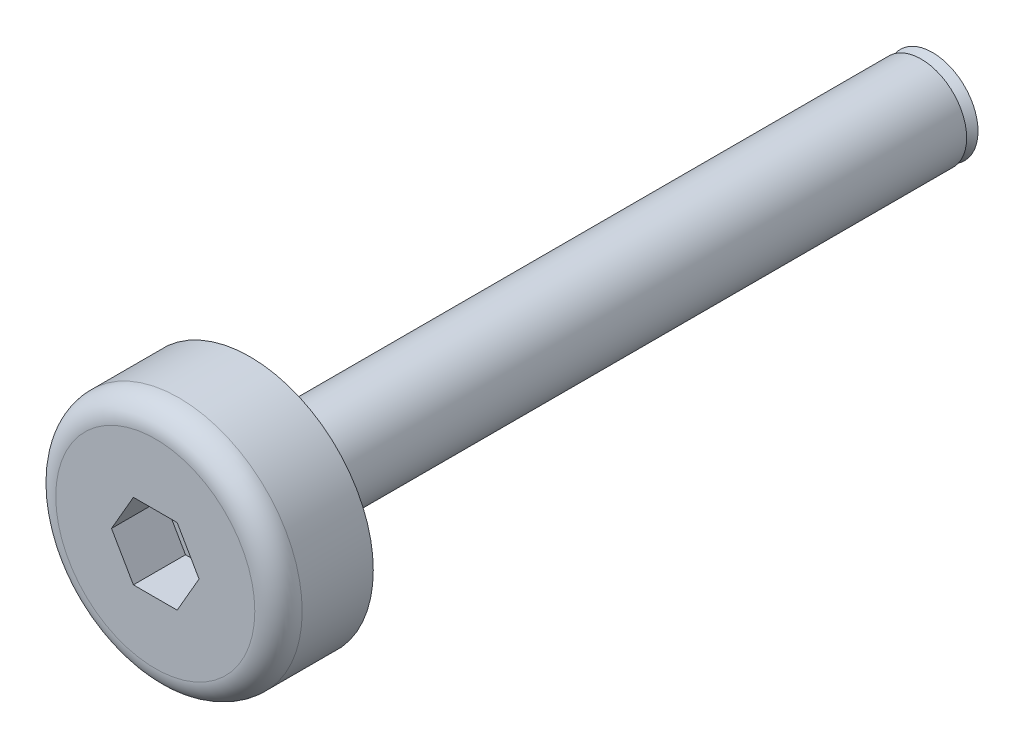
ISO-10303-21;
HEADER;
FILE_DESCRIPTION(('STEP AP214'),'2;1');
FILE_NAME('part.step','',(''),(''),'','','');
FILE_SCHEMA(('AUTOMOTIVE_DESIGN { 1 0 10303 214 1 1 1 1 }'));
ENDSEC;
DATA;
#1=APPLICATION_CONTEXT('core data for automotive mechanical design processes');
#2=APPLICATION_PROTOCOL_DEFINITION('international standard','automotive_design',2000,#1);
#3=PRODUCT_CONTEXT('',#1,'mechanical');
#4=PRODUCT('Part','Part','',(#3));
#5=PRODUCT_RELATED_PRODUCT_CATEGORY('part','',(#4));
#6=PRODUCT_DEFINITION_FORMATION('','',#4);
#7=PRODUCT_DEFINITION_CONTEXT('part definition',#1,'design');
#8=PRODUCT_DEFINITION('design','',#6,#7);
#9=PRODUCT_DEFINITION_SHAPE('','',#8);
#10=(LENGTH_UNIT() NAMED_UNIT(*) SI_UNIT(.MILLI.,.METRE.));
#11=(NAMED_UNIT(*) PLANE_ANGLE_UNIT() SI_UNIT($,.RADIAN.));
#12=(NAMED_UNIT(*) SI_UNIT($,.STERADIAN.) SOLID_ANGLE_UNIT());
#13=UNCERTAINTY_MEASURE_WITH_UNIT(LENGTH_MEASURE(1.E-05),#10,'distance_accuracy_value','');
#14=(GEOMETRIC_REPRESENTATION_CONTEXT(3) GLOBAL_UNCERTAINTY_ASSIGNED_CONTEXT((#13)) GLOBAL_UNIT_ASSIGNED_CONTEXT((#10,
#11,#12)) REPRESENTATION_CONTEXT('',''));
#15=CARTESIAN_POINT('',(0.,0.,0.));
#16=DIRECTION('',(0.,0.,1.));
#17=DIRECTION('',(1.,0.,0.));
#18=AXIS2_PLACEMENT_3D('',#15,#16,#17);
#19=CARTESIAN_POINT('',(0.,0.,2.5));
#20=DIRECTION('',(0.,0.,1.));
#21=DIRECTION('',(1.,0.,0.));
#22=AXIS2_PLACEMENT_3D('',#19,#20,#21);
#23=PLANE('',#22);
#24=CARTESIAN_POINT('',(0.,0.,2.5));
#25=DIRECTION('',(0.,0.,1.));
#26=DIRECTION('',(1.,0.,0.));
#27=AXIS2_PLACEMENT_3D('',#24,#25,#26);
#28=CIRCLE('',#27,2.625);
#29=CARTESIAN_POINT('',(2.625,0.,2.5));
#30=VERTEX_POINT('',#29);
#31=EDGE_CURVE('E142',#30,#30,#28,.T.);
#32=ORIENTED_EDGE('',*,*,#31,.T.);
#33=EDGE_LOOP('',(#32));
#34=FACE_BOUND('',#33,.T.);
#35=DIRECTION('',(0.5,-0.866025403784439,0.));
#36=VECTOR('',#35,1.);
#37=CARTESIAN_POINT('',(0.866025403784439,0.5,2.5));
#38=LINE('',#37,#36);
#39=CARTESIAN_POINT('',(0.577350269189626,1.,2.5));
#40=VERTEX_POINT('',#39);
#41=CARTESIAN_POINT('',(1.15470053837925,0.,2.5));
#42=VERTEX_POINT('',#41);
#43=EDGE_CURVE('E51',#40,#42,#38,.T.);
#44=ORIENTED_EDGE('',*,*,#43,.T.);
#45=DIRECTION('',(-0.5,-0.866025403784439,0.));
#46=VECTOR('',#45,1.);
#47=CARTESIAN_POINT('',(0.866025403784439,-0.5,2.5));
#48=LINE('',#47,#46);
#49=CARTESIAN_POINT('',(0.577350269189626,-1.,2.5));
#50=VERTEX_POINT('',#49);
#51=EDGE_CURVE('E11',#42,#50,#48,.T.);
#52=ORIENTED_EDGE('',*,*,#51,.T.);
#53=DIRECTION('',(-1.,0.,0.));
#54=VECTOR('',#53,1.);
#55=CARTESIAN_POINT('',(0.,-1.,2.5));
#56=LINE('',#55,#54);
#57=CARTESIAN_POINT('',(-0.577350269189626,-1.,2.5));
#58=VERTEX_POINT('',#57);
#59=EDGE_CURVE('E148',#50,#58,#56,.T.);
#60=ORIENTED_EDGE('',*,*,#59,.T.);
#61=DIRECTION('',(-0.5,0.866025403784439,0.));
#62=VECTOR('',#61,1.);
#63=CARTESIAN_POINT('',(-0.866025403784439,-0.5,2.5));
#64=LINE('',#63,#62);
#65=CARTESIAN_POINT('',(-1.15470053837925,0.,2.5));
#66=VERTEX_POINT('',#65);
#67=EDGE_CURVE('E151',#58,#66,#64,.T.);
#68=ORIENTED_EDGE('',*,*,#67,.T.);
#69=DIRECTION('',(0.5,0.866025403784439,0.));
#70=VECTOR('',#69,1.);
#71=CARTESIAN_POINT('',(-0.866025403784438,0.5,2.5));
#72=LINE('',#71,#70);
#73=CARTESIAN_POINT('',(-0.577350269189625,0.999999999999999,2.5));
#74=VERTEX_POINT('',#73);
#75=EDGE_CURVE('E154',#66,#74,#72,.T.);
#76=ORIENTED_EDGE('',*,*,#75,.T.);
#77=DIRECTION('',(1.,0.,0.));
#78=VECTOR('',#77,1.);
#79=CARTESIAN_POINT('',(0.,1.,2.5));
#80=LINE('',#79,#78);
#81=EDGE_CURVE('E157',#74,#40,#80,.T.);
#82=ORIENTED_EDGE('',*,*,#81,.T.);
#83=EDGE_LOOP('',(#44,#52,#60,#68,#76,#82));
#84=FACE_BOUND('',#83,.T.);
#85=ADVANCED_FACE('F43',(#34,#84),#23,.T.);
#86=CARTESIAN_POINT('',(0.,0.,2.5));
#87=DIRECTION('',(0.,0.,-1.));
#88=DIRECTION('',(-1.,0.,0.));
#89=AXIS2_PLACEMENT_3D('',#86,#87,#88);
#90=CYLINDRICAL_SURFACE('',#89,3.25);
#91=CARTESIAN_POINT('',(0.,0.,1.875));
#92=DIRECTION('',(0.,0.,1.));
#93=DIRECTION('',(1.,0.,0.));
#94=AXIS2_PLACEMENT_3D('',#91,#92,#93);
#95=CIRCLE('',#94,3.25);
#96=CARTESIAN_POINT('',(3.25,0.,1.875));
#97=VERTEX_POINT('',#96);
#98=EDGE_CURVE('E145',#97,#97,#95,.F.);
#99=ORIENTED_EDGE('',*,*,#98,.T.);
#100=EDGE_LOOP('',(#99));
#101=FACE_BOUND('',#100,.T.);
#102=CARTESIAN_POINT('',(0.,0.,0.));
#103=DIRECTION('',(0.,0.,1.));
#104=DIRECTION('',(1.,0.,0.));
#105=AXIS2_PLACEMENT_3D('',#102,#103,#104);
#106=CIRCLE('',#105,3.25);
#107=CARTESIAN_POINT('',(3.25,0.,0.));
#108=VERTEX_POINT('',#107);
#109=EDGE_CURVE('E100',#108,#108,#106,.T.);
#110=ORIENTED_EDGE('',*,*,#109,.T.);
#111=EDGE_LOOP('',(#110));
#112=FACE_BOUND('',#111,.T.);
#113=ADVANCED_FACE('F181',(#101,#112),#90,.T.);
#114=CARTESIAN_POINT('',(0.,0.,0.));
#115=DIRECTION('',(0.,0.,1.));
#116=DIRECTION('',(1.,0.,0.));
#117=AXIS2_PLACEMENT_3D('',#114,#115,#116);
#118=PLANE('',#117);
#119=CARTESIAN_POINT('',(0.,0.,0.));
#120=DIRECTION('',(0.,0.,1.));
#121=DIRECTION('',(1.,0.,0.));
#122=AXIS2_PLACEMENT_3D('',#119,#120,#121);
#123=CIRCLE('',#122,1.2);
#124=CARTESIAN_POINT('',(1.2,0.,0.));
#125=VERTEX_POINT('',#124);
#126=EDGE_CURVE('E119',#125,#125,#123,.T.);
#127=ORIENTED_EDGE('',*,*,#126,.T.);
#128=EDGE_LOOP('',(#127));
#129=FACE_BOUND('',#128,.T.);
#130=ORIENTED_EDGE('',*,*,#109,.F.);
#131=EDGE_LOOP('',(#130));
#132=FACE_BOUND('',#131,.T.);
#133=ADVANCED_FACE('F187',(#129,#132),#118,.F.);
#134=CARTESIAN_POINT('',(0.,0.,1.875));
#135=DIRECTION('',(0.,0.,1.));
#136=DIRECTION('',(1.,0.,0.));
#137=AXIS2_PLACEMENT_3D('',#134,#135,#136);
#138=TOROIDAL_SURFACE('',#137,2.625,0.625);
#139=ORIENTED_EDGE('',*,*,#98,.F.);
#140=EDGE_LOOP('',(#139));
#141=FACE_BOUND('',#140,.T.);
#142=ORIENTED_EDGE('',*,*,#31,.F.);
#143=EDGE_LOOP('',(#142));
#144=FACE_BOUND('',#143,.T.);
#145=ADVANCED_FACE('F45',(#141,#144),#138,.T.);
#146=CARTESIAN_POINT('',(0.577350269189626,-1.,2.51));
#147=DIRECTION('',(-0.866025403784439,0.5,0.));
#148=DIRECTION('',(-0.5,-0.866025403784439,0.));
#149=AXIS2_PLACEMENT_3D('',#146,#147,#148);
#150=PLANE('',#149);
#151=DIRECTION('',(0.,0.,-1.));
#152=VECTOR('',#151,1.);
#153=CARTESIAN_POINT('',(1.15470053837925,0.,2.51));
#154=LINE('',#153,#152);
#155=CARTESIAN_POINT('',(1.15470053837925,0.,1.125));
#156=VERTEX_POINT('',#155);
#157=EDGE_CURVE('E93',#42,#156,#154,.T.);
#158=ORIENTED_EDGE('',*,*,#157,.T.);
#159=DIRECTION('',(0.5,0.866025403784439,0.));
#160=VECTOR('',#159,1.);
#161=CARTESIAN_POINT('',(0.577350269189626,-1.,1.125));
#162=LINE('',#161,#160);
#163=CARTESIAN_POINT('',(0.577350269189626,-1.,1.125));
#164=VERTEX_POINT('',#163);
#165=EDGE_CURVE('E97',#164,#156,#162,.T.);
#166=ORIENTED_EDGE('',*,*,#165,.F.);
#167=DIRECTION('',(0.,0.,-1.));
#168=VECTOR('',#167,1.);
#169=CARTESIAN_POINT('',(0.577350269189626,-1.,2.51));
#170=LINE('',#169,#168);
#171=EDGE_CURVE('E132',#50,#164,#170,.T.);
#172=ORIENTED_EDGE('',*,*,#171,.F.);
#173=ORIENTED_EDGE('',*,*,#51,.F.);
#174=EDGE_LOOP('',(#158,#166,#172,#173));
#175=FACE_BOUND('',#174,.T.);
#176=ADVANCED_FACE('F95',(#175),#150,.T.);
#177=CARTESIAN_POINT('',(1.15470053837925,0.,2.51));
#178=DIRECTION('',(-0.866025403784439,-0.5,0.));
#179=DIRECTION('',(0.,0.,1.));
#180=AXIS2_PLACEMENT_3D('',#177,#178,#179);
#181=PLANE('',#180);
#182=DIRECTION('',(0.,0.,-1.));
#183=VECTOR('',#182,1.);
#184=CARTESIAN_POINT('',(0.577350269189626,1.,2.51));
#185=LINE('',#184,#183);
#186=CARTESIAN_POINT('',(0.577350269189626,1.,1.125));
#187=VERTEX_POINT('',#186);
#188=EDGE_CURVE('E101',#40,#187,#185,.T.);
#189=ORIENTED_EDGE('',*,*,#188,.T.);
#190=DIRECTION('',(-0.5,0.866025403784439,0.));
#191=VECTOR('',#190,1.);
#192=CARTESIAN_POINT('',(1.15470053837925,0.,1.125));
#193=LINE('',#192,#191);
#194=EDGE_CURVE('E104',#156,#187,#193,.T.);
#195=ORIENTED_EDGE('',*,*,#194,.F.);
#196=ORIENTED_EDGE('',*,*,#157,.F.);
#197=ORIENTED_EDGE('',*,*,#43,.F.);
#198=EDGE_LOOP('',(#189,#195,#196,#197));
#199=FACE_BOUND('',#198,.T.);
#200=ADVANCED_FACE('F105',(#199),#181,.T.);
#201=CARTESIAN_POINT('',(0.577350269189626,1.,2.51));
#202=DIRECTION('',(0.,-1.,0.));
#203=DIRECTION('',(1.,0.,0.));
#204=AXIS2_PLACEMENT_3D('',#201,#202,#203);
#205=PLANE('',#204);
#206=DIRECTION('',(0.,0.,-1.));
#207=VECTOR('',#206,1.);
#208=CARTESIAN_POINT('',(-0.577350269189625,0.999999999999999,2.51));
#209=LINE('',#208,#207);
#210=CARTESIAN_POINT('',(-0.577350269189625,0.999999999999999,1.125));
#211=VERTEX_POINT('',#210);
#212=EDGE_CURVE('E137',#74,#211,#209,.T.);
#213=ORIENTED_EDGE('',*,*,#212,.T.);
#214=DIRECTION('',(-1.,0.,0.));
#215=VECTOR('',#214,1.);
#216=CARTESIAN_POINT('',(0.577350269189626,1.,1.125));
#217=LINE('',#216,#215);
#218=EDGE_CURVE('E110',#187,#211,#217,.T.);
#219=ORIENTED_EDGE('',*,*,#218,.F.);
#220=ORIENTED_EDGE('',*,*,#188,.F.);
#221=ORIENTED_EDGE('',*,*,#81,.F.);
#222=EDGE_LOOP('',(#213,#219,#220,#221));
#223=FACE_BOUND('',#222,.T.);
#224=ADVANCED_FACE('F161',(#223),#205,.T.);
#225=CARTESIAN_POINT('',(-0.577350269189625,0.999999999999999,2.51));
#226=DIRECTION('',(0.866025403784439,-0.5,0.));
#227=DIRECTION('',(0.5,0.866025403784439,0.));
#228=AXIS2_PLACEMENT_3D('',#225,#226,#227);
#229=PLANE('',#228);
#230=DIRECTION('',(0.,0.,-1.));
#231=VECTOR('',#230,1.);
#232=CARTESIAN_POINT('',(-1.15470053837925,0.,2.51));
#233=LINE('',#232,#231);
#234=CARTESIAN_POINT('',(-1.15470053837925,0.,1.125));
#235=VERTEX_POINT('',#234);
#236=EDGE_CURVE('E135',#66,#235,#233,.T.);
#237=ORIENTED_EDGE('',*,*,#236,.T.);
#238=DIRECTION('',(-0.5,-0.866025403784439,0.));
#239=VECTOR('',#238,1.);
#240=CARTESIAN_POINT('',(-0.577350269189625,0.999999999999999,1.125));
#241=LINE('',#240,#239);
#242=EDGE_CURVE('E126',#211,#235,#241,.T.);
#243=ORIENTED_EDGE('',*,*,#242,.F.);
#244=ORIENTED_EDGE('',*,*,#212,.F.);
#245=ORIENTED_EDGE('',*,*,#75,.F.);
#246=EDGE_LOOP('',(#237,#243,#244,#245));
#247=FACE_BOUND('',#246,.T.);
#248=ADVANCED_FACE('F166',(#247),#229,.T.);
#249=CARTESIAN_POINT('',(-1.15470053837925,0.,2.51));
#250=DIRECTION('',(0.866025403784439,0.5,0.));
#251=DIRECTION('',(-0.5,0.866025403784439,0.));
#252=AXIS2_PLACEMENT_3D('',#249,#250,#251);
#253=PLANE('',#252);
#254=DIRECTION('',(0.,0.,-1.));
#255=VECTOR('',#254,1.);
#256=CARTESIAN_POINT('',(-0.577350269189626,-1.,2.51));
#257=LINE('',#256,#255);
#258=CARTESIAN_POINT('',(-0.577350269189626,-1.,1.125));
#259=VERTEX_POINT('',#258);
#260=EDGE_CURVE('E58',#58,#259,#257,.T.);
#261=ORIENTED_EDGE('',*,*,#260,.T.);
#262=DIRECTION('',(0.5,-0.866025403784439,0.));
#263=VECTOR('',#262,1.);
#264=CARTESIAN_POINT('',(-1.15470053837925,0.,1.125));
#265=LINE('',#264,#263);
#266=EDGE_CURVE('E129',#235,#259,#265,.T.);
#267=ORIENTED_EDGE('',*,*,#266,.F.);
#268=ORIENTED_EDGE('',*,*,#236,.F.);
#269=ORIENTED_EDGE('',*,*,#67,.F.);
#270=EDGE_LOOP('',(#261,#267,#268,#269));
#271=FACE_BOUND('',#270,.T.);
#272=ADVANCED_FACE('F169',(#271),#253,.T.);
#273=CARTESIAN_POINT('',(-0.577350269189626,-1.,2.51));
#274=DIRECTION('',(0.,1.,0.));
#275=DIRECTION('',(-1.,0.,0.));
#276=AXIS2_PLACEMENT_3D('',#273,#274,#275);
#277=PLANE('',#276);
#278=ORIENTED_EDGE('',*,*,#171,.T.);
#279=DIRECTION('',(1.,0.,0.));
#280=VECTOR('',#279,1.);
#281=CARTESIAN_POINT('',(-0.577350269189626,-1.,1.125));
#282=LINE('',#281,#280);
#283=EDGE_CURVE('E115',#259,#164,#282,.T.);
#284=ORIENTED_EDGE('',*,*,#283,.F.);
#285=ORIENTED_EDGE('',*,*,#260,.F.);
#286=ORIENTED_EDGE('',*,*,#59,.F.);
#287=EDGE_LOOP('',(#278,#284,#285,#286));
#288=FACE_BOUND('',#287,.T.);
#289=ADVANCED_FACE('F170',(#288),#277,.T.);
#290=CARTESIAN_POINT('',(1.15470053837925,0.,1.125));
#291=DIRECTION('',(0.,0.,1.));
#292=DIRECTION('',(-0.5,0.866025403784439,0.));
#293=AXIS2_PLACEMENT_3D('',#290,#291,#292);
#294=PLANE('',#293);
#295=ORIENTED_EDGE('',*,*,#165,.T.);
#296=ORIENTED_EDGE('',*,*,#194,.T.);
#297=ORIENTED_EDGE('',*,*,#218,.T.);
#298=ORIENTED_EDGE('',*,*,#242,.T.);
#299=ORIENTED_EDGE('',*,*,#266,.T.);
#300=ORIENTED_EDGE('',*,*,#283,.T.);
#301=EDGE_LOOP('',(#295,#296,#297,#298,#299,#300));
#302=FACE_BOUND('',#301,.T.);
#303=ADVANCED_FACE('F113',(#302),#294,.T.);
#304=CARTESIAN_POINT('',(0.,0.,0.));
#305=DIRECTION('',(0.,0.,-1.));
#306=DIRECTION('',(-1.,0.,0.));
#307=AXIS2_PLACEMENT_3D('',#304,#305,#306);
#308=CYLINDRICAL_SURFACE('',#307,1.2);
#309=ORIENTED_EDGE('',*,*,#126,.F.);
#310=EDGE_LOOP('',(#309));
#311=FACE_BOUND('',#310,.T.);
#312=CARTESIAN_POINT('',(0.,0.,-17.7));
#313=DIRECTION('',(0.,0.,1.));
#314=DIRECTION('',(1.,0.,0.));
#315=AXIS2_PLACEMENT_3D('',#312,#313,#314);
#316=CIRCLE('',#315,1.2);
#317=CARTESIAN_POINT('',(1.2,0.,-17.7));
#318=VERTEX_POINT('',#317);
#319=EDGE_CURVE('E122',#318,#318,#316,.T.);
#320=ORIENTED_EDGE('',*,*,#319,.T.);
#321=EDGE_LOOP('',(#320));
#322=FACE_BOUND('',#321,.T.);
#323=ADVANCED_FACE('F177',(#311,#322),#308,.T.);
#324=CARTESIAN_POINT('',(0.,0.,-17.7));
#325=DIRECTION('',(0.,0.,1.));
#326=DIRECTION('',(1.,0.,0.));
#327=AXIS2_PLACEMENT_3D('',#324,#325,#326);
#328=PLANE('',#327);
#329=CARTESIAN_POINT('',(0.,0.,-17.7));
#330=DIRECTION('',(0.,0.,-1.));
#331=DIRECTION('',(0.,1.,0.));
#332=AXIS2_PLACEMENT_3D('',#329,#330,#331);
#333=CIRCLE('',#332,0.9);
#334=CARTESIAN_POINT('',(0.,0.9,-17.7));
#335=VERTEX_POINT('',#334);
#336=EDGE_CURVE('E116',#335,#335,#333,.T.);
#337=ORIENTED_EDGE('',*,*,#336,.F.);
#338=EDGE_LOOP('',(#337));
#339=FACE_BOUND('',#338,.T.);
#340=ORIENTED_EDGE('',*,*,#319,.F.);
#341=EDGE_LOOP('',(#340));
#342=FACE_BOUND('',#341,.T.);
#343=ADVANCED_FACE('F219',(#339,#342),#328,.F.);
#344=CARTESIAN_POINT('',(0.,0.,-18.));
#345=DIRECTION('',(0.,0.,-1.));
#346=DIRECTION('',(0.,1.,0.));
#347=AXIS2_PLACEMENT_3D('',#344,#345,#346);
#348=PLANE('',#347);
#349=CARTESIAN_POINT('',(0.,0.,-18.));
#350=DIRECTION('',(0.,0.,-1.));
#351=DIRECTION('',(0.,1.,0.));
#352=AXIS2_PLACEMENT_3D('',#349,#350,#351);
#353=CIRCLE('',#352,1.2);
#354=CARTESIAN_POINT('',(0.,1.2,-18.));
#355=VERTEX_POINT('',#354);
#356=EDGE_CURVE('E205',#355,#355,#353,.T.);
#357=ORIENTED_EDGE('',*,*,#356,.T.);
#358=EDGE_LOOP('',(#357));
#359=FACE_BOUND('',#358,.T.);
#360=ADVANCED_FACE('F210',(#359),#348,.T.);
#361=CARTESIAN_POINT('',(0.,0.,-18.));
#362=DIRECTION('',(0.,0.,-1.));
#363=DIRECTION('',(0.,1.,0.));
#364=AXIS2_PLACEMENT_3D('',#361,#362,#363);
#365=CONICAL_SURFACE('',#364,1.2,0.785398163397457);
#366=ORIENTED_EDGE('',*,*,#336,.T.);
#367=EDGE_LOOP('',(#366));
#368=FACE_BOUND('',#367,.T.);
#369=ORIENTED_EDGE('',*,*,#356,.F.);
#370=EDGE_LOOP('',(#369));
#371=FACE_BOUND('',#370,.T.);
#372=ADVANCED_FACE('F212',(#368,#371),#365,.T.);
#373=CLOSED_SHELL('',(#85,#113,#133,#145,#176,#200,#224,#248,#272,#289,#303,#323,#343,#360,#372));
#374=MANIFOLD_SOLID_BREP('B2',#373);
#375=ADVANCED_BREP_SHAPE_REPRESENTATION('',(#18,#374),#14);
#376=SHAPE_DEFINITION_REPRESENTATION(#9,#375);
ENDSEC;
END-ISO-10303-21;
